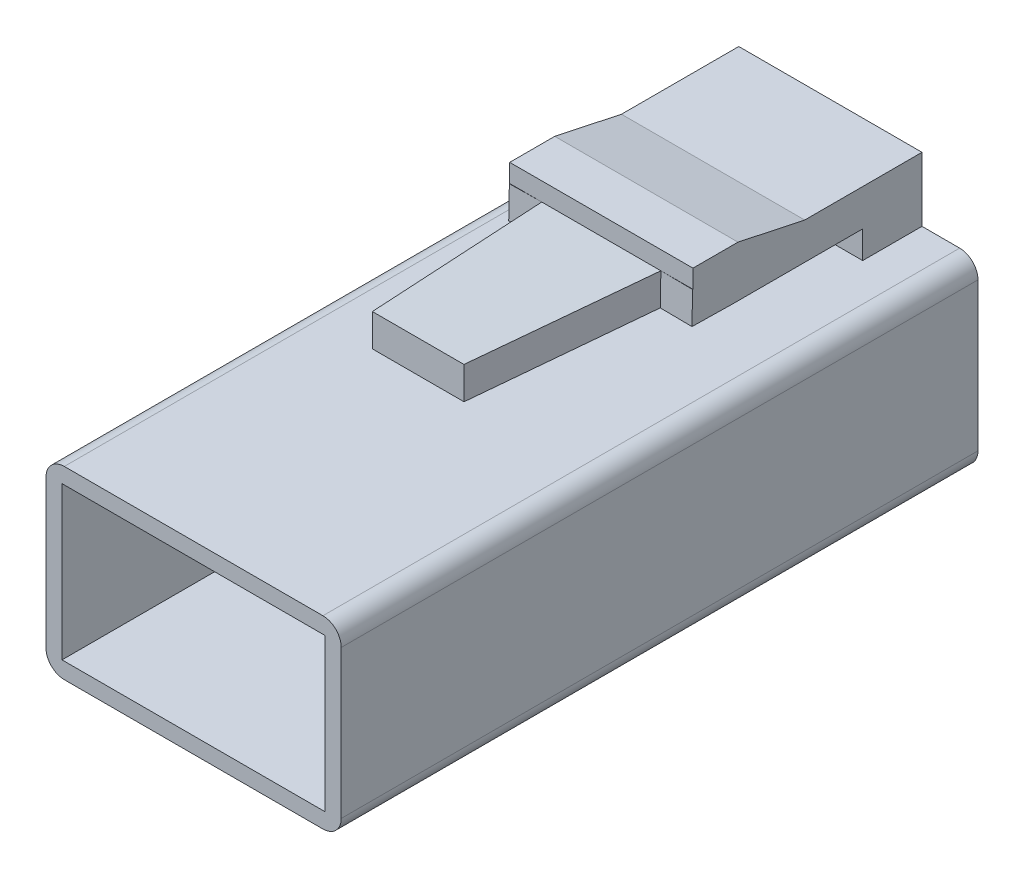
ISO-10303-21;
HEADER;
FILE_DESCRIPTION(('STEP AP214'),'2;1');
FILE_NAME('part.step','',(''),(''),'','','');
FILE_SCHEMA(('AUTOMOTIVE_DESIGN { 1 0 10303 214 1 1 1 1 }'));
ENDSEC;
DATA;
#1=APPLICATION_CONTEXT('core data for automotive mechanical design processes');
#2=APPLICATION_PROTOCOL_DEFINITION('international standard','automotive_design',2000,#1);
#3=PRODUCT_CONTEXT('',#1,'mechanical');
#4=PRODUCT('Part','Part','',(#3));
#5=PRODUCT_RELATED_PRODUCT_CATEGORY('part','',(#4));
#6=PRODUCT_DEFINITION_FORMATION('','',#4);
#7=PRODUCT_DEFINITION_CONTEXT('part definition',#1,'design');
#8=PRODUCT_DEFINITION('design','',#6,#7);
#9=PRODUCT_DEFINITION_SHAPE('','',#8);
#10=(LENGTH_UNIT() NAMED_UNIT(*) SI_UNIT(.MILLI.,.METRE.));
#11=(NAMED_UNIT(*) PLANE_ANGLE_UNIT() SI_UNIT($,.RADIAN.));
#12=(NAMED_UNIT(*) SI_UNIT($,.STERADIAN.) SOLID_ANGLE_UNIT());
#13=UNCERTAINTY_MEASURE_WITH_UNIT(LENGTH_MEASURE(1.E-05),#10,'distance_accuracy_value','');
#14=(GEOMETRIC_REPRESENTATION_CONTEXT(3) GLOBAL_UNCERTAINTY_ASSIGNED_CONTEXT((#13)) GLOBAL_UNIT_ASSIGNED_CONTEXT((#10,
#11,#12)) REPRESENTATION_CONTEXT('',''));
#15=CARTESIAN_POINT('',(0.,0.,0.));
#16=DIRECTION('',(0.,0.,1.));
#17=DIRECTION('',(1.,0.,0.));
#18=AXIS2_PLACEMENT_3D('',#15,#16,#17);
#19=CARTESIAN_POINT('',(-2.,3.326,1.1));
#20=DIRECTION('',(0.,0.999805434858456,-0.0197254259141513));
#21=DIRECTION('',(0.,0.0197254259141513,0.999805434858456));
#22=AXIS2_PLACEMENT_3D('',#19,#20,#21);
#23=PLANE('',#22);
#24=DIRECTION('',(-0.0748042062033559,-0.019670160013498,-0.997004220422025));
#25=VECTOR('',#24,1.);
#26=CARTESIAN_POINT('',(-1.,3.40488658009427,5.09845518463892));
#27=LINE('',#26,#25);
#28=CARTESIAN_POINT('',(-1.,3.40488658009427,5.09845518463892));
#29=VERTEX_POINT('',#28);
#30=CARTESIAN_POINT('',(-1.3,3.326,1.1));
#31=VERTEX_POINT('',#30);
#32=EDGE_CURVE('E250',#29,#31,#27,.T.);
#33=ORIENTED_EDGE('',*,*,#32,.F.);
#34=DIRECTION('',(1.,0.,0.));
#35=VECTOR('',#34,1.);
#36=CARTESIAN_POINT('',(-2.,3.40488658009427,5.09845518463892));
#37=LINE('',#36,#35);
#38=CARTESIAN_POINT('',(1.,3.40488658009427,5.09845518463892));
#39=VERTEX_POINT('',#38);
#40=EDGE_CURVE('E280',#29,#39,#37,.T.);
#41=ORIENTED_EDGE('',*,*,#40,.T.);
#42=DIRECTION('',(-0.0748042062033556,0.019670160013498,0.997004220422025));
#43=VECTOR('',#42,1.);
#44=CARTESIAN_POINT('',(1.,3.40488658009427,5.09845518463892));
#45=LINE('',#44,#43);
#46=CARTESIAN_POINT('',(1.3,3.326,1.1));
#47=VERTEX_POINT('',#46);
#48=EDGE_CURVE('E271',#47,#39,#45,.T.);
#49=ORIENTED_EDGE('',*,*,#48,.F.);
#50=DIRECTION('',(1.,0.,0.));
#51=VECTOR('',#50,1.);
#52=CARTESIAN_POINT('',(-2.,3.326,1.1));
#53=LINE('',#52,#51);
#54=EDGE_CURVE('E270',#31,#47,#53,.T.);
#55=ORIENTED_EDGE('',*,*,#54,.F.);
#56=EDGE_LOOP('',(#33,#41,#49,#55));
#57=FACE_BOUND('',#56,.T.);
#58=ADVANCED_FACE('F33',(#57),#23,.T.);
#59=DIRECTION('',(-0.999936480758269,-0.000222324407221732,-0.011268763047742));
#60=VECTOR('',#59,1.);
#61=CARTESIAN_POINT('',(1.3,3.326,1.1));
#62=LINE('',#61,#60);
#63=CARTESIAN_POINT('',(2.,3.326155636971,1.10788863521355));
#64=VERTEX_POINT('',#63);
#65=EDGE_CURVE('E900',#64,#47,#62,.T.);
#66=ORIENTED_EDGE('',*,*,#65,.F.);
#67=DIRECTION('',(0.,0.0197254259141513,0.999805434858455));
#68=VECTOR('',#67,1.);
#69=CARTESIAN_POINT('',(2.,3.326,1.1));
#70=LINE('',#69,#68);
#71=CARTESIAN_POINT('',(2.,3.326,1.1));
#72=VERTEX_POINT('',#71);
#73=EDGE_CURVE('E847',#72,#64,#70,.T.);
#74=ORIENTED_EDGE('',*,*,#73,.F.);
#75=EDGE_CURVE('E274',#47,#72,#53,.T.);
#76=ORIENTED_EDGE('',*,*,#75,.F.);
#77=EDGE_LOOP('',(#66,#74,#76));
#78=FACE_BOUND('',#77,.T.);
#79=ADVANCED_FACE('F472',(#78),#23,.T.);
#80=CARTESIAN_POINT('',(3.2225,2.016,10.));
#81=DIRECTION('',(0.,-1.,0.));
#82=DIRECTION('',(0.,0.,-1.));
#83=AXIS2_PLACEMENT_3D('',#80,#81,#82);
#84=PLANE('',#83);
#85=DIRECTION('',(0.,0.,-1.));
#86=VECTOR('',#85,1.);
#87=CARTESIAN_POINT('',(-2.,2.016,-2.60530460098422));
#88=LINE('',#87,#86);
#89=CARTESIAN_POINT('',(-2.,2.016,-2.60530460098422));
#90=VERTEX_POINT('',#89);
#91=CARTESIAN_POINT('',(-2.,2.016,-3.9));
#92=VERTEX_POINT('',#91);
#93=EDGE_CURVE('E862',#90,#92,#88,.T.);
#94=ORIENTED_EDGE('',*,*,#93,.T.);
#95=DIRECTION('',(-1.,0.,0.));
#96=VECTOR('',#95,1.);
#97=CARTESIAN_POINT('',(3.2225,2.016,-3.9));
#98=LINE('',#97,#96);
#99=CARTESIAN_POINT('',(-2.8225,2.016,-3.9));
#100=VERTEX_POINT('',#99);
#101=EDGE_CURVE('E361',#92,#100,#98,.T.);
#102=ORIENTED_EDGE('',*,*,#101,.T.);
#103=DIRECTION('',(0.,0.,-1.));
#104=VECTOR('',#103,1.);
#105=CARTESIAN_POINT('',(-2.8225,2.016,10.));
#106=LINE('',#105,#104);
#107=CARTESIAN_POINT('',(-2.8225,2.016,10.));
#108=VERTEX_POINT('',#107);
#109=EDGE_CURVE('E415',#100,#108,#106,.F.);
#110=ORIENTED_EDGE('',*,*,#109,.T.);
#111=DIRECTION('',(-1.,0.,0.));
#112=VECTOR('',#111,1.);
#113=CARTESIAN_POINT('',(3.2225,2.016,10.));
#114=LINE('',#113,#112);
#115=CARTESIAN_POINT('',(2.8225,2.016,10.));
#116=VERTEX_POINT('',#115);
#117=EDGE_CURVE('E383',#116,#108,#114,.T.);
#118=ORIENTED_EDGE('',*,*,#117,.F.);
#119=DIRECTION('',(0.,0.,-1.));
#120=VECTOR('',#119,1.);
#121=CARTESIAN_POINT('',(2.8225,2.016,10.));
#122=LINE('',#121,#120);
#123=CARTESIAN_POINT('',(2.8225,2.016,-3.9));
#124=VERTEX_POINT('',#123);
#125=EDGE_CURVE('E417',#116,#124,#122,.T.);
#126=ORIENTED_EDGE('',*,*,#125,.T.);
#127=CARTESIAN_POINT('',(2.,2.016,-3.9));
#128=VERTEX_POINT('',#127);
#129=EDGE_CURVE('E362',#124,#128,#98,.T.);
#130=ORIENTED_EDGE('',*,*,#129,.T.);
#131=DIRECTION('',(0.,0.,-1.));
#132=VECTOR('',#131,1.);
#133=CARTESIAN_POINT('',(2.,2.016,-2.60530460098422));
#134=LINE('',#133,#132);
#135=CARTESIAN_POINT('',(2.,2.016,-2.60530460098422));
#136=VERTEX_POINT('',#135);
#137=EDGE_CURVE('E909',#136,#128,#134,.T.);
#138=ORIENTED_EDGE('',*,*,#137,.F.);
#139=DIRECTION('',(1.,0.,0.));
#140=VECTOR('',#139,1.);
#141=CARTESIAN_POINT('',(-2.,2.016,-2.60530460098422));
#142=LINE('',#141,#140);
#143=EDGE_CURVE('E334',#90,#136,#142,.T.);
#144=ORIENTED_EDGE('',*,*,#143,.F.);
#145=EDGE_LOOP('',(#94,#102,#110,#118,#126,#130,#138,#144));
#146=FACE_BOUND('',#145,.T.);
#147=ADVANCED_FACE('F460',(#146),#84,.F.);
#148=CARTESIAN_POINT('',(0.,0.,10.));
#149=DIRECTION('',(0.,0.,1.));
#150=DIRECTION('',(1.,0.,0.));
#151=AXIS2_PLACEMENT_3D('',#148,#149,#150);
#152=PLANE('',#151);
#153=DIRECTION('',(1.,0.,0.));
#154=VECTOR('',#153,1.);
#155=CARTESIAN_POINT('',(3.2225,-2.016,10.));
#156=LINE('',#155,#154);
#157=CARTESIAN_POINT('',(-2.8225,-2.016,10.));
#158=VERTEX_POINT('',#157);
#159=CARTESIAN_POINT('',(2.8225,-2.016,10.));
#160=VERTEX_POINT('',#159);
#161=EDGE_CURVE('E377',#158,#160,#156,.T.);
#162=ORIENTED_EDGE('',*,*,#161,.T.);
#163=CARTESIAN_POINT('',(2.8225,-1.616,10.));
#164=DIRECTION('',(0.,0.,1.));
#165=DIRECTION('',(1.,0.,0.));
#166=AXIS2_PLACEMENT_3D('',#163,#164,#165);
#167=CIRCLE('',#166,0.4);
#168=CARTESIAN_POINT('',(3.2225,-1.616,10.));
#169=VERTEX_POINT('',#168);
#170=EDGE_CURVE('E413',#160,#169,#167,.T.);
#171=ORIENTED_EDGE('',*,*,#170,.T.);
#172=DIRECTION('',(0.,1.,0.));
#173=VECTOR('',#172,1.);
#174=CARTESIAN_POINT('',(3.2225,-2.016,10.));
#175=LINE('',#174,#173);
#176=CARTESIAN_POINT('',(3.2225,1.616,10.));
#177=VERTEX_POINT('',#176);
#178=EDGE_CURVE('E380',#169,#177,#175,.T.);
#179=ORIENTED_EDGE('',*,*,#178,.T.);
#180=CARTESIAN_POINT('',(2.8225,1.616,10.));
#181=DIRECTION('',(0.,0.,1.));
#182=DIRECTION('',(1.,0.,0.));
#183=AXIS2_PLACEMENT_3D('',#180,#181,#182);
#184=CIRCLE('',#183,0.4);
#185=EDGE_CURVE('E411',#177,#116,#184,.T.);
#186=ORIENTED_EDGE('',*,*,#185,.T.);
#187=ORIENTED_EDGE('',*,*,#117,.T.);
#188=CARTESIAN_POINT('',(-2.8225,1.616,10.));
#189=DIRECTION('',(0.,0.,1.));
#190=DIRECTION('',(1.,0.,0.));
#191=AXIS2_PLACEMENT_3D('',#188,#189,#190);
#192=CIRCLE('',#191,0.4);
#193=CARTESIAN_POINT('',(-3.2225,1.616,10.));
#194=VERTEX_POINT('',#193);
#195=EDGE_CURVE('E407',#108,#194,#192,.T.);
#196=ORIENTED_EDGE('',*,*,#195,.T.);
#197=DIRECTION('',(0.,-1.,0.));
#198=VECTOR('',#197,1.);
#199=CARTESIAN_POINT('',(-3.2225,-2.016,10.));
#200=LINE('',#199,#198);
#201=CARTESIAN_POINT('',(-3.2225,-1.616,10.));
#202=VERTEX_POINT('',#201);
#203=EDGE_CURVE('E374',#194,#202,#200,.T.);
#204=ORIENTED_EDGE('',*,*,#203,.T.);
#205=CARTESIAN_POINT('',(-2.8225,-1.616,10.));
#206=DIRECTION('',(0.,0.,1.));
#207=DIRECTION('',(1.,0.,0.));
#208=AXIS2_PLACEMENT_3D('',#205,#206,#207);
#209=CIRCLE('',#208,0.4);
#210=EDGE_CURVE('E409',#202,#158,#209,.T.);
#211=ORIENTED_EDGE('',*,*,#210,.T.);
#212=EDGE_LOOP('',(#162,#171,#179,#186,#187,#196,#204,#211));
#213=FACE_BOUND('',#212,.T.);
#214=DIRECTION('',(0.,-1.,0.));
#215=VECTOR('',#214,1.);
#216=CARTESIAN_POINT('',(-2.8725,-1.666,10.));
#217=LINE('',#216,#215);
#218=CARTESIAN_POINT('',(-2.8725,1.666,10.));
#219=VERTEX_POINT('',#218);
#220=CARTESIAN_POINT('',(-2.8725,-1.666,10.));
#221=VERTEX_POINT('',#220);
#222=EDGE_CURVE('E322',#219,#221,#217,.T.);
#223=ORIENTED_EDGE('',*,*,#222,.F.);
#224=DIRECTION('',(-1.,0.,0.));
#225=VECTOR('',#224,1.);
#226=CARTESIAN_POINT('',(-2.8725,1.666,10.));
#227=LINE('',#226,#225);
#228=CARTESIAN_POINT('',(2.8725,1.666,10.));
#229=VERTEX_POINT('',#228);
#230=EDGE_CURVE('E325',#229,#219,#227,.T.);
#231=ORIENTED_EDGE('',*,*,#230,.F.);
#232=DIRECTION('',(0.,1.,0.));
#233=VECTOR('',#232,1.);
#234=CARTESIAN_POINT('',(2.8725,1.666,10.));
#235=LINE('',#234,#233);
#236=CARTESIAN_POINT('',(2.8725,-1.666,10.));
#237=VERTEX_POINT('',#236);
#238=EDGE_CURVE('E305',#237,#229,#235,.T.);
#239=ORIENTED_EDGE('',*,*,#238,.F.);
#240=DIRECTION('',(1.,0.,0.));
#241=VECTOR('',#240,1.);
#242=CARTESIAN_POINT('',(2.8725,-1.666,10.));
#243=LINE('',#242,#241);
#244=EDGE_CURVE('E319',#221,#237,#243,.T.);
#245=ORIENTED_EDGE('',*,*,#244,.F.);
#246=EDGE_LOOP('',(#223,#231,#239,#245));
#247=FACE_BOUND('',#246,.T.);
#248=ADVANCED_FACE('F443',(#213,#247),#152,.T.);
#249=CARTESIAN_POINT('',(-3.2225,-2.016,10.));
#250=DIRECTION('',(1.,0.,0.));
#251=DIRECTION('',(0.,0.,-1.));
#252=AXIS2_PLACEMENT_3D('',#249,#250,#251);
#253=PLANE('',#252);
#254=DIRECTION('',(0.,-1.,0.));
#255=VECTOR('',#254,1.);
#256=CARTESIAN_POINT('',(-3.2225,-2.016,-3.9));
#257=LINE('',#256,#255);
#258=CARTESIAN_POINT('',(-3.2225,1.616,-3.9));
#259=VERTEX_POINT('',#258);
#260=CARTESIAN_POINT('',(-3.2225,-1.616,-3.9));
#261=VERTEX_POINT('',#260);
#262=EDGE_CURVE('E352',#259,#261,#257,.T.);
#263=ORIENTED_EDGE('',*,*,#262,.T.);
#264=DIRECTION('',(0.,0.,-1.));
#265=VECTOR('',#264,1.);
#266=CARTESIAN_POINT('',(-3.2225,-1.616,10.));
#267=LINE('',#266,#265);
#268=EDGE_CURVE('E11',#261,#202,#267,.F.);
#269=ORIENTED_EDGE('',*,*,#268,.T.);
#270=ORIENTED_EDGE('',*,*,#203,.F.);
#271=DIRECTION('',(0.,0.,-1.));
#272=VECTOR('',#271,1.);
#273=CARTESIAN_POINT('',(-3.2225,1.616,10.));
#274=LINE('',#273,#272);
#275=EDGE_CURVE('E41',#194,#259,#274,.T.);
#276=ORIENTED_EDGE('',*,*,#275,.T.);
#277=EDGE_LOOP('',(#263,#269,#270,#276));
#278=FACE_BOUND('',#277,.T.);
#279=ADVANCED_FACE('F424',(#278),#253,.F.);
#280=CARTESIAN_POINT('',(3.2225,-2.016,10.));
#281=DIRECTION('',(0.,1.,0.));
#282=DIRECTION('',(0.,0.,1.));
#283=AXIS2_PLACEMENT_3D('',#280,#281,#282);
#284=PLANE('',#283);
#285=DIRECTION('',(1.,0.,0.));
#286=VECTOR('',#285,1.);
#287=CARTESIAN_POINT('',(3.2225,-2.016,-3.9));
#288=LINE('',#287,#286);
#289=CARTESIAN_POINT('',(-2.8225,-2.016,-3.9));
#290=VERTEX_POINT('',#289);
#291=CARTESIAN_POINT('',(2.8225,-2.016,-3.9));
#292=VERTEX_POINT('',#291);
#293=EDGE_CURVE('E355',#290,#292,#288,.T.);
#294=ORIENTED_EDGE('',*,*,#293,.T.);
#295=DIRECTION('',(0.,0.,-1.));
#296=VECTOR('',#295,1.);
#297=CARTESIAN_POINT('',(2.8225,-2.016,10.));
#298=LINE('',#297,#296);
#299=EDGE_CURVE('E405',#292,#160,#298,.F.);
#300=ORIENTED_EDGE('',*,*,#299,.T.);
#301=ORIENTED_EDGE('',*,*,#161,.F.);
#302=DIRECTION('',(0.,0.,-1.));
#303=VECTOR('',#302,1.);
#304=CARTESIAN_POINT('',(-2.8225,-2.016,10.));
#305=LINE('',#304,#303);
#306=EDGE_CURVE('E402',#158,#290,#305,.T.);
#307=ORIENTED_EDGE('',*,*,#306,.T.);
#308=EDGE_LOOP('',(#294,#300,#301,#307));
#309=FACE_BOUND('',#308,.T.);
#310=ADVANCED_FACE('F439',(#309),#284,.F.);
#311=CARTESIAN_POINT('',(3.2225,-2.016,10.));
#312=DIRECTION('',(-1.,0.,0.));
#313=DIRECTION('',(0.,0.,1.));
#314=AXIS2_PLACEMENT_3D('',#311,#312,#313);
#315=PLANE('',#314);
#316=ORIENTED_EDGE('',*,*,#178,.F.);
#317=DIRECTION('',(0.,0.,-1.));
#318=VECTOR('',#317,1.);
#319=CARTESIAN_POINT('',(3.2225,-1.616,10.));
#320=LINE('',#319,#318);
#321=CARTESIAN_POINT('',(3.2225,-1.616,-3.9));
#322=VERTEX_POINT('',#321);
#323=EDGE_CURVE('E390',#169,#322,#320,.T.);
#324=ORIENTED_EDGE('',*,*,#323,.T.);
#325=DIRECTION('',(0.,1.,0.));
#326=VECTOR('',#325,1.);
#327=CARTESIAN_POINT('',(3.2225,-2.016,-3.9));
#328=LINE('',#327,#326);
#329=CARTESIAN_POINT('',(3.2225,1.616,-3.9));
#330=VERTEX_POINT('',#329);
#331=EDGE_CURVE('E358',#322,#330,#328,.T.);
#332=ORIENTED_EDGE('',*,*,#331,.T.);
#333=DIRECTION('',(0.,0.,-1.));
#334=VECTOR('',#333,1.);
#335=CARTESIAN_POINT('',(3.2225,1.616,10.));
#336=LINE('',#335,#334);
#337=EDGE_CURVE('E388',#330,#177,#336,.F.);
#338=ORIENTED_EDGE('',*,*,#337,.T.);
#339=EDGE_LOOP('',(#316,#324,#332,#338));
#340=FACE_BOUND('',#339,.T.);
#341=ADVANCED_FACE('F450',(#340),#315,.F.);
#342=CARTESIAN_POINT('',(-2.2725,-1.066,10.));
#343=DIRECTION('',(1.,0.,0.));
#344=DIRECTION('',(0.,0.,-1.));
#345=AXIS2_PLACEMENT_3D('',#342,#343,#344);
#346=PLANE('',#345);
#347=DIRECTION('',(0.,1.,0.));
#348=VECTOR('',#347,1.);
#349=CARTESIAN_POINT('',(-2.2725,-1.066,0.));
#350=LINE('',#349,#348);
#351=CARTESIAN_POINT('',(-2.2725,-1.066,0.));
#352=VERTEX_POINT('',#351);
#353=CARTESIAN_POINT('',(-2.2725,1.066,0.));
#354=VERTEX_POINT('',#353);
#355=EDGE_CURVE('E338',#352,#354,#350,.T.);
#356=ORIENTED_EDGE('',*,*,#355,.F.);
#357=DIRECTION('',(0.,0.,-1.));
#358=VECTOR('',#357,1.);
#359=CARTESIAN_POINT('',(-2.2725,-1.066,10.));
#360=LINE('',#359,#358);
#361=CARTESIAN_POINT('',(-2.2725,-1.066,-3.9));
#362=VERTEX_POINT('',#361);
#363=EDGE_CURVE('E372',#352,#362,#360,.T.);
#364=ORIENTED_EDGE('',*,*,#363,.T.);
#365=DIRECTION('',(0.,-1.,0.));
#366=VECTOR('',#365,1.);
#367=CARTESIAN_POINT('',(-2.2725,-1.066,-3.9));
#368=LINE('',#367,#366);
#369=CARTESIAN_POINT('',(-2.2725,1.066,-3.9));
#370=VERTEX_POINT('',#369);
#371=EDGE_CURVE('E340',#370,#362,#368,.T.);
#372=ORIENTED_EDGE('',*,*,#371,.F.);
#373=DIRECTION('',(0.,0.,-1.));
#374=VECTOR('',#373,1.);
#375=CARTESIAN_POINT('',(-2.2725,1.066,10.));
#376=LINE('',#375,#374);
#377=EDGE_CURVE('E365',#354,#370,#376,.T.);
#378=ORIENTED_EDGE('',*,*,#377,.F.);
#379=EDGE_LOOP('',(#356,#364,#372,#378));
#380=FACE_BOUND('',#379,.T.);
#381=ADVANCED_FACE('F644',(#380),#346,.T.);
#382=CARTESIAN_POINT('',(2.2725,-1.066,10.));
#383=DIRECTION('',(0.,1.,0.));
#384=DIRECTION('',(-1.,0.,0.));
#385=AXIS2_PLACEMENT_3D('',#382,#383,#384);
#386=PLANE('',#385);
#387=DIRECTION('',(-1.,0.,0.));
#388=VECTOR('',#387,1.);
#389=CARTESIAN_POINT('',(2.2725,-1.066,0.));
#390=LINE('',#389,#388);
#391=CARTESIAN_POINT('',(2.2725,-1.066,0.));
#392=VERTEX_POINT('',#391);
#393=EDGE_CURVE('E336',#392,#352,#390,.T.);
#394=ORIENTED_EDGE('',*,*,#393,.F.);
#395=DIRECTION('',(0.,0.,-1.));
#396=VECTOR('',#395,1.);
#397=CARTESIAN_POINT('',(2.2725,-1.066,10.));
#398=LINE('',#397,#396);
#399=CARTESIAN_POINT('',(2.2725,-1.066,-3.9));
#400=VERTEX_POINT('',#399);
#401=EDGE_CURVE('E370',#392,#400,#398,.T.);
#402=ORIENTED_EDGE('',*,*,#401,.T.);
#403=DIRECTION('',(1.,0.,0.));
#404=VECTOR('',#403,1.);
#405=CARTESIAN_POINT('',(2.2725,-1.066,-3.9));
#406=LINE('',#405,#404);
#407=EDGE_CURVE('E343',#362,#400,#406,.T.);
#408=ORIENTED_EDGE('',*,*,#407,.F.);
#409=ORIENTED_EDGE('',*,*,#363,.F.);
#410=EDGE_LOOP('',(#394,#402,#408,#409));
#411=FACE_BOUND('',#410,.T.);
#412=ADVANCED_FACE('F652',(#411),#386,.T.);
#413=CARTESIAN_POINT('',(2.2725,-1.066,10.));
#414=DIRECTION('',(-1.,0.,0.));
#415=DIRECTION('',(0.,0.,1.));
#416=AXIS2_PLACEMENT_3D('',#413,#414,#415);
#417=PLANE('',#416);
#418=DIRECTION('',(0.,-1.,0.));
#419=VECTOR('',#418,1.);
#420=CARTESIAN_POINT('',(2.2725,-1.066,0.));
#421=LINE('',#420,#419);
#422=CARTESIAN_POINT('',(2.2725,1.066,0.));
#423=VERTEX_POINT('',#422);
#424=EDGE_CURVE('E321',#423,#392,#421,.T.);
#425=ORIENTED_EDGE('',*,*,#424,.F.);
#426=DIRECTION('',(0.,0.,-1.));
#427=VECTOR('',#426,1.);
#428=CARTESIAN_POINT('',(2.2725,1.066,10.));
#429=LINE('',#428,#427);
#430=CARTESIAN_POINT('',(2.2725,1.066,-3.9));
#431=VERTEX_POINT('',#430);
#432=EDGE_CURVE('E368',#423,#431,#429,.T.);
#433=ORIENTED_EDGE('',*,*,#432,.T.);
#434=DIRECTION('',(0.,1.,0.));
#435=VECTOR('',#434,1.);
#436=CARTESIAN_POINT('',(2.2725,-1.066,-3.9));
#437=LINE('',#436,#435);
#438=EDGE_CURVE('E346',#400,#431,#437,.T.);
#439=ORIENTED_EDGE('',*,*,#438,.F.);
#440=ORIENTED_EDGE('',*,*,#401,.F.);
#441=EDGE_LOOP('',(#425,#433,#439,#440));
#442=FACE_BOUND('',#441,.T.);
#443=ADVANCED_FACE('F660',(#442),#417,.T.);
#444=CARTESIAN_POINT('',(2.2725,1.066,10.));
#445=DIRECTION('',(0.,-1.,0.));
#446=DIRECTION('',(1.,0.,0.));
#447=AXIS2_PLACEMENT_3D('',#444,#445,#446);
#448=PLANE('',#447);
#449=DIRECTION('',(1.,0.,0.));
#450=VECTOR('',#449,1.);
#451=CARTESIAN_POINT('',(2.2725,1.066,0.));
#452=LINE('',#451,#450);
#453=EDGE_CURVE('E386',#354,#423,#452,.T.);
#454=ORIENTED_EDGE('',*,*,#453,.F.);
#455=ORIENTED_EDGE('',*,*,#377,.T.);
#456=DIRECTION('',(-1.,0.,0.));
#457=VECTOR('',#456,1.);
#458=CARTESIAN_POINT('',(2.2725,1.066,-3.9));
#459=LINE('',#458,#457);
#460=EDGE_CURVE('E349',#431,#370,#459,.T.);
#461=ORIENTED_EDGE('',*,*,#460,.F.);
#462=ORIENTED_EDGE('',*,*,#432,.F.);
#463=EDGE_LOOP('',(#454,#455,#461,#462));
#464=FACE_BOUND('',#463,.T.);
#465=ADVANCED_FACE('F668',(#464),#448,.T.);
#466=CARTESIAN_POINT('',(0.,0.,-3.9));
#467=DIRECTION('',(0.,0.,1.));
#468=DIRECTION('',(1.,0.,0.));
#469=AXIS2_PLACEMENT_3D('',#466,#467,#468);
#470=PLANE('',#469);
#471=ORIENTED_EDGE('',*,*,#460,.T.);
#472=ORIENTED_EDGE('',*,*,#371,.T.);
#473=ORIENTED_EDGE('',*,*,#407,.T.);
#474=ORIENTED_EDGE('',*,*,#438,.T.);
#475=EDGE_LOOP('',(#471,#472,#473,#474));
#476=FACE_BOUND('',#475,.T.);
#477=ORIENTED_EDGE('',*,*,#331,.F.);
#478=CARTESIAN_POINT('',(2.8225,-1.616,-3.9));
#479=DIRECTION('',(0.,0.,1.));
#480=DIRECTION('',(1.,0.,0.));
#481=AXIS2_PLACEMENT_3D('',#478,#479,#480);
#482=CIRCLE('',#481,0.4);
#483=EDGE_CURVE('E400',#322,#292,#482,.F.);
#484=ORIENTED_EDGE('',*,*,#483,.T.);
#485=ORIENTED_EDGE('',*,*,#293,.F.);
#486=CARTESIAN_POINT('',(-2.8225,-1.616,-3.9));
#487=DIRECTION('',(0.,0.,1.));
#488=DIRECTION('',(1.,0.,0.));
#489=AXIS2_PLACEMENT_3D('',#486,#487,#488);
#490=CIRCLE('',#489,0.4);
#491=EDGE_CURVE('E396',#290,#261,#490,.F.);
#492=ORIENTED_EDGE('',*,*,#491,.T.);
#493=ORIENTED_EDGE('',*,*,#262,.F.);
#494=CARTESIAN_POINT('',(-2.8225,1.616,-3.9));
#495=DIRECTION('',(0.,0.,1.));
#496=DIRECTION('',(1.,0.,0.));
#497=AXIS2_PLACEMENT_3D('',#494,#495,#496);
#498=CIRCLE('',#497,0.4);
#499=EDGE_CURVE('E393',#259,#100,#498,.F.);
#500=ORIENTED_EDGE('',*,*,#499,.T.);
#501=ORIENTED_EDGE('',*,*,#101,.F.);
#502=EDGE_CURVE('E366',#128,#92,#98,.T.);
#503=ORIENTED_EDGE('',*,*,#502,.F.);
#504=ORIENTED_EDGE('',*,*,#129,.F.);
#505=CARTESIAN_POINT('',(2.8225,1.616,-3.9));
#506=DIRECTION('',(0.,0.,1.));
#507=DIRECTION('',(1.,0.,0.));
#508=AXIS2_PLACEMENT_3D('',#505,#506,#507);
#509=CIRCLE('',#508,0.4);
#510=EDGE_CURVE('E398',#124,#330,#509,.F.);
#511=ORIENTED_EDGE('',*,*,#510,.T.);
#512=EDGE_LOOP('',(#477,#484,#485,#492,#493,#500,#501,#503,#504,#511));
#513=FACE_BOUND('',#512,.T.);
#514=ADVANCED_FACE('F430',(#476,#513),#470,.F.);
#515=CARTESIAN_POINT('',(-2.8725,1.666,16.6413288579922));
#516=DIRECTION('',(0.,-1.,0.));
#517=DIRECTION('',(0.,0.,-1.));
#518=AXIS2_PLACEMENT_3D('',#515,#516,#517);
#519=PLANE('',#518);
#520=ORIENTED_EDGE('',*,*,#230,.T.);
#521=DIRECTION('',(0.,0.,-1.));
#522=VECTOR('',#521,1.);
#523=CARTESIAN_POINT('',(-2.8725,1.666,16.6413288579922));
#524=LINE('',#523,#522);
#525=CARTESIAN_POINT('',(-2.8725,1.666,0.));
#526=VERTEX_POINT('',#525);
#527=EDGE_CURVE('E314',#219,#526,#524,.T.);
#528=ORIENTED_EDGE('',*,*,#527,.T.);
#529=DIRECTION('',(-1.,0.,0.));
#530=VECTOR('',#529,1.);
#531=CARTESIAN_POINT('',(-2.8725,1.666,0.));
#532=LINE('',#531,#530);
#533=CARTESIAN_POINT('',(2.8725,1.666,0.));
#534=VERTEX_POINT('',#533);
#535=EDGE_CURVE('E315',#534,#526,#532,.T.);
#536=ORIENTED_EDGE('',*,*,#535,.F.);
#537=DIRECTION('',(0.,0.,-1.));
#538=VECTOR('',#537,1.);
#539=CARTESIAN_POINT('',(2.8725,1.666,16.6413288579922));
#540=LINE('',#539,#538);
#541=EDGE_CURVE('E318',#229,#534,#540,.T.);
#542=ORIENTED_EDGE('',*,*,#541,.F.);
#543=EDGE_LOOP('',(#520,#528,#536,#542));
#544=FACE_BOUND('',#543,.T.);
#545=ADVANCED_FACE('F683',(#544),#519,.T.);
#546=CARTESIAN_POINT('',(-2.8725,-1.666,16.6413288579922));
#547=DIRECTION('',(1.,0.,0.));
#548=DIRECTION('',(0.,0.,-1.));
#549=AXIS2_PLACEMENT_3D('',#546,#547,#548);
#550=PLANE('',#549);
#551=ORIENTED_EDGE('',*,*,#222,.T.);
#552=DIRECTION('',(0.,0.,-1.));
#553=VECTOR('',#552,1.);
#554=CARTESIAN_POINT('',(-2.8725,-1.666,16.6413288579922));
#555=LINE('',#554,#553);
#556=CARTESIAN_POINT('',(-2.8725,-1.666,0.));
#557=VERTEX_POINT('',#556);
#558=EDGE_CURVE('E310',#221,#557,#555,.T.);
#559=ORIENTED_EDGE('',*,*,#558,.T.);
#560=DIRECTION('',(0.,-1.,0.));
#561=VECTOR('',#560,1.);
#562=CARTESIAN_POINT('',(-2.8725,-1.666,0.));
#563=LINE('',#562,#561);
#564=EDGE_CURVE('E311',#526,#557,#563,.T.);
#565=ORIENTED_EDGE('',*,*,#564,.F.);
#566=ORIENTED_EDGE('',*,*,#527,.F.);
#567=EDGE_LOOP('',(#551,#559,#565,#566));
#568=FACE_BOUND('',#567,.T.);
#569=ADVANCED_FACE('F691',(#568),#550,.T.);
#570=CARTESIAN_POINT('',(2.8725,-1.666,16.6413288579922));
#571=DIRECTION('',(0.,1.,0.));
#572=DIRECTION('',(-1.,0.,0.));
#573=AXIS2_PLACEMENT_3D('',#570,#571,#572);
#574=PLANE('',#573);
#575=ORIENTED_EDGE('',*,*,#244,.T.);
#576=DIRECTION('',(0.,0.,-1.));
#577=VECTOR('',#576,1.);
#578=CARTESIAN_POINT('',(2.8725,-1.666,16.6413288579922));
#579=LINE('',#578,#577);
#580=CARTESIAN_POINT('',(2.8725,-1.666,0.));
#581=VERTEX_POINT('',#580);
#582=EDGE_CURVE('E306',#237,#581,#579,.T.);
#583=ORIENTED_EDGE('',*,*,#582,.T.);
#584=DIRECTION('',(1.,0.,0.));
#585=VECTOR('',#584,1.);
#586=CARTESIAN_POINT('',(2.8725,-1.666,0.));
#587=LINE('',#586,#585);
#588=EDGE_CURVE('E307',#557,#581,#587,.T.);
#589=ORIENTED_EDGE('',*,*,#588,.F.);
#590=ORIENTED_EDGE('',*,*,#558,.F.);
#591=EDGE_LOOP('',(#575,#583,#589,#590));
#592=FACE_BOUND('',#591,.T.);
#593=ADVANCED_FACE('F699',(#592),#574,.T.);
#594=CARTESIAN_POINT('',(2.8725,1.666,16.6413288579922));
#595=DIRECTION('',(-1.,0.,0.));
#596=DIRECTION('',(0.,0.,1.));
#597=AXIS2_PLACEMENT_3D('',#594,#595,#596);
#598=PLANE('',#597);
#599=ORIENTED_EDGE('',*,*,#238,.T.);
#600=ORIENTED_EDGE('',*,*,#541,.T.);
#601=DIRECTION('',(0.,1.,0.));
#602=VECTOR('',#601,1.);
#603=CARTESIAN_POINT('',(2.8725,1.666,0.));
#604=LINE('',#603,#602);
#605=EDGE_CURVE('E302',#581,#534,#604,.T.);
#606=ORIENTED_EDGE('',*,*,#605,.F.);
#607=ORIENTED_EDGE('',*,*,#582,.F.);
#608=EDGE_LOOP('',(#599,#600,#606,#607));
#609=FACE_BOUND('',#608,.T.);
#610=ADVANCED_FACE('F707',(#609),#598,.T.);
#611=CARTESIAN_POINT('',(0.,0.,0.));
#612=DIRECTION('',(0.,0.,-1.));
#613=DIRECTION('',(-1.,0.,0.));
#614=AXIS2_PLACEMENT_3D('',#611,#612,#613);
#615=PLANE('',#614);
#616=ORIENTED_EDGE('',*,*,#355,.T.);
#617=ORIENTED_EDGE('',*,*,#453,.T.);
#618=ORIENTED_EDGE('',*,*,#424,.T.);
#619=ORIENTED_EDGE('',*,*,#393,.T.);
#620=EDGE_LOOP('',(#616,#617,#618,#619));
#621=FACE_BOUND('',#620,.T.);
#622=ORIENTED_EDGE('',*,*,#535,.T.);
#623=ORIENTED_EDGE('',*,*,#564,.T.);
#624=ORIENTED_EDGE('',*,*,#588,.T.);
#625=ORIENTED_EDGE('',*,*,#605,.T.);
#626=EDGE_LOOP('',(#622,#623,#624,#625));
#627=FACE_BOUND('',#626,.T.);
#628=ADVANCED_FACE('F715',(#621,#627),#615,.F.);
#629=CARTESIAN_POINT('',(2.8225,-1.616,10.));
#630=DIRECTION('',(0.,0.,-1.));
#631=DIRECTION('',(-1.,0.,0.));
#632=AXIS2_PLACEMENT_3D('',#629,#630,#631);
#633=CYLINDRICAL_SURFACE('',#632,0.4);
#634=ORIENTED_EDGE('',*,*,#170,.F.);
#635=ORIENTED_EDGE('',*,*,#299,.F.);
#636=ORIENTED_EDGE('',*,*,#483,.F.);
#637=ORIENTED_EDGE('',*,*,#323,.F.);
#638=EDGE_LOOP('',(#634,#635,#636,#637));
#639=FACE_BOUND('',#638,.T.);
#640=ADVANCED_FACE('F448',(#639),#633,.T.);
#641=CARTESIAN_POINT('',(2.8225,1.616,10.));
#642=DIRECTION('',(0.,0.,-1.));
#643=DIRECTION('',(-1.,0.,0.));
#644=AXIS2_PLACEMENT_3D('',#641,#642,#643);
#645=CYLINDRICAL_SURFACE('',#644,0.4);
#646=ORIENTED_EDGE('',*,*,#185,.F.);
#647=ORIENTED_EDGE('',*,*,#337,.F.);
#648=ORIENTED_EDGE('',*,*,#510,.F.);
#649=ORIENTED_EDGE('',*,*,#125,.F.);
#650=EDGE_LOOP('',(#646,#647,#648,#649));
#651=FACE_BOUND('',#650,.T.);
#652=ADVANCED_FACE('F456',(#651),#645,.T.);
#653=CARTESIAN_POINT('',(-2.8225,-1.616,10.));
#654=DIRECTION('',(0.,0.,-1.));
#655=DIRECTION('',(-1.,0.,0.));
#656=AXIS2_PLACEMENT_3D('',#653,#654,#655);
#657=CYLINDRICAL_SURFACE('',#656,0.4);
#658=ORIENTED_EDGE('',*,*,#210,.F.);
#659=ORIENTED_EDGE('',*,*,#268,.F.);
#660=ORIENTED_EDGE('',*,*,#491,.F.);
#661=ORIENTED_EDGE('',*,*,#306,.F.);
#662=EDGE_LOOP('',(#658,#659,#660,#661));
#663=FACE_BOUND('',#662,.T.);
#664=ADVANCED_FACE('F436',(#663),#657,.T.);
#665=CARTESIAN_POINT('',(-2.8225,1.616,10.));
#666=DIRECTION('',(0.,0.,-1.));
#667=DIRECTION('',(-1.,0.,0.));
#668=AXIS2_PLACEMENT_3D('',#665,#666,#667);
#669=CYLINDRICAL_SURFACE('',#668,0.4);
#670=ORIENTED_EDGE('',*,*,#195,.F.);
#671=ORIENTED_EDGE('',*,*,#109,.F.);
#672=ORIENTED_EDGE('',*,*,#499,.F.);
#673=ORIENTED_EDGE('',*,*,#275,.F.);
#674=EDGE_LOOP('',(#670,#671,#672,#673));
#675=FACE_BOUND('',#674,.T.);
#676=ADVANCED_FACE('F35',(#675),#669,.T.);
#677=CARTESIAN_POINT('',(-2.,2.016,-3.9));
#678=DIRECTION('',(0.,-1.,0.));
#679=DIRECTION('',(0.,0.,-1.));
#680=AXIS2_PLACEMENT_3D('',#677,#678,#679);
#681=PLANE('',#680);
#682=ORIENTED_EDGE('',*,*,#502,.T.);
#683=CARTESIAN_POINT('',(-2.,2.016,-3.9001));
#684=VERTEX_POINT('',#683);
#685=EDGE_CURVE('E861',#92,#684,#88,.T.);
#686=ORIENTED_EDGE('',*,*,#685,.T.);
#687=DIRECTION('',(1.,0.,0.));
#688=VECTOR('',#687,1.);
#689=CARTESIAN_POINT('',(-2.,2.016,-3.9001));
#690=LINE('',#689,#688);
#691=CARTESIAN_POINT('',(2.,2.016,-3.9001));
#692=VERTEX_POINT('',#691);
#693=EDGE_CURVE('E298',#684,#692,#690,.T.);
#694=ORIENTED_EDGE('',*,*,#693,.T.);
#695=EDGE_CURVE('E908',#128,#692,#134,.T.);
#696=ORIENTED_EDGE('',*,*,#695,.F.);
#697=EDGE_LOOP('',(#682,#686,#694,#696));
#698=FACE_BOUND('',#697,.T.);
#699=ADVANCED_FACE('F463',(#698),#681,.T.);
#700=CARTESIAN_POINT('',(-2.,2.616,-2.60530460098422));
#701=DIRECTION('',(0.,0.,1.));
#702=DIRECTION('',(1.,0.,0.));
#703=AXIS2_PLACEMENT_3D('',#700,#701,#702);
#704=PLANE('',#703);
#705=ORIENTED_EDGE('',*,*,#143,.T.);
#706=DIRECTION('',(0.,-1.,0.));
#707=VECTOR('',#706,1.);
#708=CARTESIAN_POINT('',(2.,2.616,-2.60530460098422));
#709=LINE('',#708,#707);
#710=CARTESIAN_POINT('',(2.,2.616,-2.60530460098422));
#711=VERTEX_POINT('',#710);
#712=EDGE_CURVE('E858',#711,#136,#709,.T.);
#713=ORIENTED_EDGE('',*,*,#712,.F.);
#714=DIRECTION('',(1.,0.,0.));
#715=VECTOR('',#714,1.);
#716=CARTESIAN_POINT('',(-2.,2.616,-2.60530460098422));
#717=LINE('',#716,#715);
#718=CARTESIAN_POINT('',(-2.,2.616,-2.60530460098422));
#719=VERTEX_POINT('',#718);
#720=EDGE_CURVE('E884',#719,#711,#717,.T.);
#721=ORIENTED_EDGE('',*,*,#720,.F.);
#722=DIRECTION('',(0.,-1.,0.));
#723=VECTOR('',#722,1.);
#724=CARTESIAN_POINT('',(-2.,2.616,-2.60530460098422));
#725=LINE('',#724,#723);
#726=EDGE_CURVE('E301',#719,#90,#725,.T.);
#727=ORIENTED_EDGE('',*,*,#726,.T.);
#728=EDGE_LOOP('',(#705,#713,#721,#727));
#729=FACE_BOUND('',#728,.T.);
#730=ADVANCED_FACE('F468',(#729),#704,.T.);
#731=CARTESIAN_POINT('',(-2.,2.616,0.216775102824342));
#732=DIRECTION('',(0.,-1.,0.));
#733=DIRECTION('',(0.,0.,-1.));
#734=AXIS2_PLACEMENT_3D('',#731,#732,#733);
#735=PLANE('',#734);
#736=ORIENTED_EDGE('',*,*,#720,.T.);
#737=DIRECTION('',(0.,0.,-1.));
#738=VECTOR('',#737,1.);
#739=CARTESIAN_POINT('',(2.,2.616,0.216775102824342));
#740=LINE('',#739,#738);
#741=CARTESIAN_POINT('',(2.,2.616,0.216775102824342));
#742=VERTEX_POINT('',#741);
#743=EDGE_CURVE('E855',#742,#711,#740,.T.);
#744=ORIENTED_EDGE('',*,*,#743,.F.);
#745=DIRECTION('',(1.,0.,0.));
#746=VECTOR('',#745,1.);
#747=CARTESIAN_POINT('',(-2.,2.616,0.216775102824342));
#748=LINE('',#747,#746);
#749=CARTESIAN_POINT('',(-2.,2.616,0.216775102824342));
#750=VERTEX_POINT('',#749);
#751=EDGE_CURVE('E886',#750,#742,#748,.T.);
#752=ORIENTED_EDGE('',*,*,#751,.F.);
#753=DIRECTION('',(0.,0.,-1.));
#754=VECTOR('',#753,1.);
#755=CARTESIAN_POINT('',(-2.,2.616,0.216775102824342));
#756=LINE('',#755,#754);
#757=EDGE_CURVE('E877',#750,#719,#756,.T.);
#758=ORIENTED_EDGE('',*,*,#757,.T.);
#759=EDGE_LOOP('',(#736,#744,#752,#758));
#760=FACE_BOUND('',#759,.T.);
#761=ADVANCED_FACE('F492',(#760),#735,.T.);
#762=CARTESIAN_POINT('',(-2.,2.69906963534574,5.09845518463892));
#763=DIRECTION('',(0.,-0.999855248964891,0.0170141446260373));
#764=DIRECTION('',(0.,-0.0170141446260373,-0.999855248964891));
#765=AXIS2_PLACEMENT_3D('',#762,#763,#764);
#766=PLANE('',#765);
#767=DIRECTION('',(-0.0748039327049657,-0.0169664754327229,-0.997053915474615));
#768=VECTOR('',#767,1.);
#769=CARTESIAN_POINT('',(-0.99916722308154,2.69949540063216,5.12347575815623));
#770=LINE('',#769,#768);
#771=CARTESIAN_POINT('',(-1.00104439067356,2.69906963534574,5.09845518463892));
#772=VERTEX_POINT('',#771);
#773=CARTESIAN_POINT('',(-1.3,2.63126273245045,1.11370665533819));
#774=VERTEX_POINT('',#773);
#775=EDGE_CURVE('E247',#772,#774,#770,.T.);
#776=ORIENTED_EDGE('',*,*,#775,.T.);
#777=DIRECTION('',(-0.99993648029122,0.000191766380156685,0.0112693659298766));
#778=VECTOR('',#777,1.);
#779=CARTESIAN_POINT('',(-1.30012615370754,2.63126275664402,1.11370807710079));
#780=LINE('',#779,#778);
#781=CARTESIAN_POINT('',(-2.,2.63139697744376,1.12159571259972));
#782=VERTEX_POINT('',#781);
#783=EDGE_CURVE('E244',#774,#782,#780,.T.);
#784=ORIENTED_EDGE('',*,*,#783,.T.);
#785=DIRECTION('',(0.,-0.0170141446260373,-0.999855248964891));
#786=VECTOR('',#785,1.);
#787=CARTESIAN_POINT('',(-2.,2.69906963534574,5.09845518463892));
#788=LINE('',#787,#786);
#789=EDGE_CURVE('E875',#782,#750,#788,.T.);
#790=ORIENTED_EDGE('',*,*,#789,.T.);
#791=ORIENTED_EDGE('',*,*,#751,.T.);
#792=DIRECTION('',(0.,-0.0170141446260373,-0.999855248964891));
#793=VECTOR('',#792,1.);
#794=CARTESIAN_POINT('',(2.,2.69906963534574,5.09845518463892));
#795=LINE('',#794,#793);
#796=CARTESIAN_POINT('',(2.,2.63139697744376,1.12159571259972));
#797=VERTEX_POINT('',#796);
#798=EDGE_CURVE('E853',#797,#742,#795,.T.);
#799=ORIENTED_EDGE('',*,*,#798,.F.);
#800=DIRECTION('',(-0.99993648029122,-0.00019176638015668,-0.0112693659298763));
#801=VECTOR('',#800,1.);
#802=CARTESIAN_POINT('',(1.30012615370754,2.63126275664402,1.11370807710079));
#803=LINE('',#802,#801);
#804=CARTESIAN_POINT('',(1.3,2.63126273245045,1.11370665533818));
#805=VERTEX_POINT('',#804);
#806=EDGE_CURVE('E56',#797,#805,#803,.T.);
#807=ORIENTED_EDGE('',*,*,#806,.T.);
#808=DIRECTION('',(-0.0748039327049655,0.0169664754327229,0.997053915474615));
#809=VECTOR('',#808,1.);
#810=CARTESIAN_POINT('',(0.999167223081541,2.69949540063216,5.12347575815623));
#811=LINE('',#810,#809);
#812=CARTESIAN_POINT('',(1.00104439067356,2.69906963534574,5.09845518463892));
#813=VERTEX_POINT('',#812);
#814=EDGE_CURVE('E266',#805,#813,#811,.T.);
#815=ORIENTED_EDGE('',*,*,#814,.T.);
#816=DIRECTION('',(1.,0.,0.));
#817=VECTOR('',#816,1.);
#818=CARTESIAN_POINT('',(-2.,2.69906963534574,5.09845518463892));
#819=LINE('',#818,#817);
#820=EDGE_CURVE('E281',#772,#813,#819,.T.);
#821=ORIENTED_EDGE('',*,*,#820,.F.);
#822=EDGE_LOOP('',(#776,#784,#790,#791,#799,#807,#815,#821));
#823=FACE_BOUND('',#822,.T.);
#824=ADVANCED_FACE('F487',(#823),#766,.T.);
#825=CARTESIAN_POINT('',(-2.,3.40488658009427,5.09845518463892));
#826=DIRECTION('',(0.,0.,1.));
#827=DIRECTION('',(1.,0.,0.));
#828=AXIS2_PLACEMENT_3D('',#825,#826,#827);
#829=PLANE('',#828);
#830=DIRECTION('',(0.0014796889448416,0.999998905259714,0.));
#831=VECTOR('',#830,1.);
#832=CARTESIAN_POINT('',(-1.00000218947937,3.4034068927693,5.09845518463892));
#833=LINE('',#832,#831);
#834=EDGE_CURVE('E253',#772,#29,#833,.T.);
#835=ORIENTED_EDGE('',*,*,#834,.F.);
#836=ORIENTED_EDGE('',*,*,#820,.T.);
#837=DIRECTION('',(0.0014796889448416,-0.999998905259714,0.));
#838=VECTOR('',#837,1.);
#839=CARTESIAN_POINT('',(0.999993431561881,3.40932564206917,5.09845518463892));
#840=LINE('',#839,#838);
#841=EDGE_CURVE('E892',#39,#813,#840,.T.);
#842=ORIENTED_EDGE('',*,*,#841,.F.);
#843=ORIENTED_EDGE('',*,*,#40,.F.);
#844=EDGE_LOOP('',(#835,#836,#842,#843));
#845=FACE_BOUND('',#844,.T.);
#846=ADVANCED_FACE('F481',(#845),#829,.T.);
#847=DIRECTION('',(-0.999936480758269,0.000222324407221732,0.0112687630477423));
#848=VECTOR('',#847,1.);
#849=CARTESIAN_POINT('',(-1.3,3.326,1.1));
#850=LINE('',#849,#848);
#851=CARTESIAN_POINT('',(-2.,3.326155636971,1.10788863521355));
#852=VERTEX_POINT('',#851);
#853=EDGE_CURVE('E48',#31,#852,#850,.T.);
#854=ORIENTED_EDGE('',*,*,#853,.F.);
#855=CARTESIAN_POINT('',(-2.,3.326,1.1));
#856=VERTEX_POINT('',#855);
#857=EDGE_CURVE('E263',#856,#31,#53,.T.);
#858=ORIENTED_EDGE('',*,*,#857,.F.);
#859=DIRECTION('',(0.,0.0197254259141513,0.999805434858455));
#860=VECTOR('',#859,1.);
#861=CARTESIAN_POINT('',(-2.,3.326,1.1));
#862=LINE('',#861,#860);
#863=EDGE_CURVE('E265',#856,#852,#862,.T.);
#864=ORIENTED_EDGE('',*,*,#863,.T.);
#865=EDGE_LOOP('',(#854,#858,#864));
#866=FACE_BOUND('',#865,.T.);
#867=ADVANCED_FACE('F261',(#866),#23,.T.);
#868=CARTESIAN_POINT('',(-2.,3.726,1.1));
#869=DIRECTION('',(0.,0.,1.));
#870=DIRECTION('',(1.,0.,0.));
#871=AXIS2_PLACEMENT_3D('',#868,#869,#870);
#872=PLANE('',#871);
#873=ORIENTED_EDGE('',*,*,#857,.T.);
#874=ORIENTED_EDGE('',*,*,#54,.T.);
#875=ORIENTED_EDGE('',*,*,#75,.T.);
#876=DIRECTION('',(0.,-1.,0.));
#877=VECTOR('',#876,1.);
#878=CARTESIAN_POINT('',(2.,3.726,1.1));
#879=LINE('',#878,#877);
#880=CARTESIAN_POINT('',(2.,3.726,1.1));
#881=VERTEX_POINT('',#880);
#882=EDGE_CURVE('E845',#881,#72,#879,.T.);
#883=ORIENTED_EDGE('',*,*,#882,.F.);
#884=DIRECTION('',(1.,0.,0.));
#885=VECTOR('',#884,1.);
#886=CARTESIAN_POINT('',(-2.,3.726,1.1));
#887=LINE('',#886,#885);
#888=CARTESIAN_POINT('',(-2.,3.726,1.1));
#889=VERTEX_POINT('',#888);
#890=EDGE_CURVE('E284',#889,#881,#887,.T.);
#891=ORIENTED_EDGE('',*,*,#890,.F.);
#892=DIRECTION('',(0.,-1.,0.));
#893=VECTOR('',#892,1.);
#894=CARTESIAN_POINT('',(-2.,3.726,1.1));
#895=LINE('',#894,#893);
#896=EDGE_CURVE('E279',#889,#856,#895,.T.);
#897=ORIENTED_EDGE('',*,*,#896,.T.);
#898=EDGE_LOOP('',(#873,#874,#875,#883,#891,#897));
#899=FACE_BOUND('',#898,.T.);
#900=ADVANCED_FACE('F277',(#899),#872,.T.);
#901=CARTESIAN_POINT('',(-2.,3.726,0.117243489549749));
#902=DIRECTION('',(0.,1.,0.));
#903=DIRECTION('',(0.,0.,1.));
#904=AXIS2_PLACEMENT_3D('',#901,#902,#903);
#905=PLANE('',#904);
#906=ORIENTED_EDGE('',*,*,#890,.T.);
#907=DIRECTION('',(0.,0.,1.));
#908=VECTOR('',#907,1.);
#909=CARTESIAN_POINT('',(2.,3.726,0.117243489549749));
#910=LINE('',#909,#908);
#911=CARTESIAN_POINT('',(2.,3.726,0.117243489549749));
#912=VERTEX_POINT('',#911);
#913=EDGE_CURVE('E840',#912,#881,#910,.T.);
#914=ORIENTED_EDGE('',*,*,#913,.F.);
#915=DIRECTION('',(1.,0.,0.));
#916=VECTOR('',#915,1.);
#917=CARTESIAN_POINT('',(-2.,3.726,0.117243489549749));
#918=LINE('',#917,#916);
#919=CARTESIAN_POINT('',(-2.,3.726,0.117243489549749));
#920=VERTEX_POINT('',#919);
#921=EDGE_CURVE('E287',#920,#912,#918,.T.);
#922=ORIENTED_EDGE('',*,*,#921,.F.);
#923=DIRECTION('',(0.,0.,1.));
#924=VECTOR('',#923,1.);
#925=CARTESIAN_POINT('',(-2.,3.726,0.117243489549749));
#926=LINE('',#925,#924);
#927=EDGE_CURVE('E871',#920,#889,#926,.T.);
#928=ORIENTED_EDGE('',*,*,#927,.T.);
#929=EDGE_LOOP('',(#906,#914,#922,#928));
#930=FACE_BOUND('',#929,.T.);
#931=ADVANCED_FACE('F486',(#930),#905,.T.);
#932=CARTESIAN_POINT('',(-2.,3.416,-1.33985387379636));
#933=DIRECTION('',(0.,0.97810875943982,-0.208094340881955));
#934=DIRECTION('',(0.,0.208094340881955,0.978108759439821));
#935=AXIS2_PLACEMENT_3D('',#932,#933,#934);
#936=PLANE('',#935);
#937=ORIENTED_EDGE('',*,*,#921,.T.);
#938=DIRECTION('',(0.,0.208094340881955,0.978108759439821));
#939=VECTOR('',#938,1.);
#940=CARTESIAN_POINT('',(2.,3.416,-1.33985387379636));
#941=LINE('',#940,#939);
#942=CARTESIAN_POINT('',(2.,3.416,-1.33985387379636));
#943=VERTEX_POINT('',#942);
#944=EDGE_CURVE('E835',#943,#912,#941,.T.);
#945=ORIENTED_EDGE('',*,*,#944,.F.);
#946=DIRECTION('',(1.,0.,0.));
#947=VECTOR('',#946,1.);
#948=CARTESIAN_POINT('',(-2.,3.416,-1.33985387379636));
#949=LINE('',#948,#947);
#950=CARTESIAN_POINT('',(-2.,3.416,-1.33985387379636));
#951=VERTEX_POINT('',#950);
#952=EDGE_CURVE('E292',#951,#943,#949,.T.);
#953=ORIENTED_EDGE('',*,*,#952,.F.);
#954=DIRECTION('',(0.,0.208094340881955,0.978108759439821));
#955=VECTOR('',#954,1.);
#956=CARTESIAN_POINT('',(-2.,3.416,-1.33985387379636));
#957=LINE('',#956,#955);
#958=EDGE_CURVE('E837',#951,#920,#957,.T.);
#959=ORIENTED_EDGE('',*,*,#958,.T.);
#960=EDGE_LOOP('',(#937,#945,#953,#959));
#961=FACE_BOUND('',#960,.T.);
#962=ADVANCED_FACE('F558',(#961),#936,.T.);
#963=CARTESIAN_POINT('',(-2.,3.416,-3.9001));
#964=DIRECTION('',(0.,1.,0.));
#965=DIRECTION('',(0.,0.,1.));
#966=AXIS2_PLACEMENT_3D('',#963,#964,#965);
#967=PLANE('',#966);
#968=ORIENTED_EDGE('',*,*,#952,.T.);
#969=DIRECTION('',(0.,0.,1.));
#970=VECTOR('',#969,1.);
#971=CARTESIAN_POINT('',(2.,3.416,-3.9001));
#972=LINE('',#971,#970);
#973=CARTESIAN_POINT('',(2.,3.416,-3.9001));
#974=VERTEX_POINT('',#973);
#975=EDGE_CURVE('E843',#974,#943,#972,.T.);
#976=ORIENTED_EDGE('',*,*,#975,.F.);
#977=DIRECTION('',(1.,0.,0.));
#978=VECTOR('',#977,1.);
#979=CARTESIAN_POINT('',(-2.,3.416,-3.9001));
#980=LINE('',#979,#978);
#981=CARTESIAN_POINT('',(-2.,3.416,-3.9001));
#982=VERTEX_POINT('',#981);
#983=EDGE_CURVE('E296',#982,#974,#980,.T.);
#984=ORIENTED_EDGE('',*,*,#983,.F.);
#985=DIRECTION('',(0.,0.,1.));
#986=VECTOR('',#985,1.);
#987=CARTESIAN_POINT('',(-2.,3.416,-3.9001));
#988=LINE('',#987,#986);
#989=EDGE_CURVE('E867',#982,#951,#988,.T.);
#990=ORIENTED_EDGE('',*,*,#989,.T.);
#991=EDGE_LOOP('',(#968,#976,#984,#990));
#992=FACE_BOUND('',#991,.T.);
#993=ADVANCED_FACE('F550',(#992),#967,.T.);
#994=CARTESIAN_POINT('',(-2.,2.016,-3.9001));
#995=DIRECTION('',(0.,0.,-1.));
#996=DIRECTION('',(-1.,0.,0.));
#997=AXIS2_PLACEMENT_3D('',#994,#995,#996);
#998=PLANE('',#997);
#999=ORIENTED_EDGE('',*,*,#983,.T.);
#1000=DIRECTION('',(0.,1.,0.));
#1001=VECTOR('',#1000,1.);
#1002=CARTESIAN_POINT('',(2.,2.016,-3.9001));
#1003=LINE('',#1002,#1001);
#1004=EDGE_CURVE('E912',#692,#974,#1003,.T.);
#1005=ORIENTED_EDGE('',*,*,#1004,.F.);
#1006=ORIENTED_EDGE('',*,*,#693,.F.);
#1007=DIRECTION('',(0.,1.,0.));
#1008=VECTOR('',#1007,1.);
#1009=CARTESIAN_POINT('',(-2.,2.016,-3.9001));
#1010=LINE('',#1009,#1008);
#1011=EDGE_CURVE('E864',#684,#982,#1010,.T.);
#1012=ORIENTED_EDGE('',*,*,#1011,.T.);
#1013=EDGE_LOOP('',(#999,#1005,#1006,#1012));
#1014=FACE_BOUND('',#1013,.T.);
#1015=ADVANCED_FACE('F506',(#1014),#998,.T.);
#1016=CARTESIAN_POINT('',(-2.,0.,0.));
#1017=DIRECTION('',(1.,0.,0.));
#1018=DIRECTION('',(0.,0.,-1.));
#1019=AXIS2_PLACEMENT_3D('',#1016,#1017,#1018);
#1020=PLANE('',#1019);
#1021=ORIENTED_EDGE('',*,*,#789,.F.);
#1022=DIRECTION('',(0.,0.999805434858455,-0.0197254259141513));
#1023=VECTOR('',#1022,1.);
#1024=CARTESIAN_POINT('',(-2.,-1.49557035551402,1.20301774286494));
#1025=LINE('',#1024,#1023);
#1026=EDGE_CURVE('E906',#782,#852,#1025,.T.);
#1027=ORIENTED_EDGE('',*,*,#1026,.T.);
#1028=ORIENTED_EDGE('',*,*,#863,.F.);
#1029=ORIENTED_EDGE('',*,*,#896,.F.);
#1030=ORIENTED_EDGE('',*,*,#927,.F.);
#1031=ORIENTED_EDGE('',*,*,#958,.F.);
#1032=ORIENTED_EDGE('',*,*,#989,.F.);
#1033=ORIENTED_EDGE('',*,*,#1011,.F.);
#1034=ORIENTED_EDGE('',*,*,#685,.F.);
#1035=ORIENTED_EDGE('',*,*,#93,.F.);
#1036=ORIENTED_EDGE('',*,*,#726,.F.);
#1037=ORIENTED_EDGE('',*,*,#757,.F.);
#1038=EDGE_LOOP('',(#1021,#1027,#1028,#1029,#1030,#1031,#1032,#1033,#1034,#1035,#1036,#1037));
#1039=FACE_BOUND('',#1038,.T.);
#1040=ADVANCED_FACE('F502',(#1039),#1020,.F.);
#1041=CARTESIAN_POINT('',(2.,0.,0.));
#1042=DIRECTION('',(1.,0.,0.));
#1043=DIRECTION('',(0.,0.,-1.));
#1044=AXIS2_PLACEMENT_3D('',#1041,#1042,#1043);
#1045=PLANE('',#1044);
#1046=DIRECTION('',(0.,0.999805434858455,-0.0197254259141513));
#1047=VECTOR('',#1046,1.);
#1048=CARTESIAN_POINT('',(2.,-1.49557035551402,1.20301774286494));
#1049=LINE('',#1048,#1047);
#1050=EDGE_CURVE('E902',#797,#64,#1049,.T.);
#1051=ORIENTED_EDGE('',*,*,#1050,.F.);
#1052=ORIENTED_EDGE('',*,*,#798,.T.);
#1053=ORIENTED_EDGE('',*,*,#743,.T.);
#1054=ORIENTED_EDGE('',*,*,#712,.T.);
#1055=ORIENTED_EDGE('',*,*,#137,.T.);
#1056=ORIENTED_EDGE('',*,*,#695,.T.);
#1057=ORIENTED_EDGE('',*,*,#1004,.T.);
#1058=ORIENTED_EDGE('',*,*,#975,.T.);
#1059=ORIENTED_EDGE('',*,*,#944,.T.);
#1060=ORIENTED_EDGE('',*,*,#913,.T.);
#1061=ORIENTED_EDGE('',*,*,#882,.T.);
#1062=ORIENTED_EDGE('',*,*,#73,.T.);
#1063=EDGE_LOOP('',(#1051,#1052,#1053,#1054,#1055,#1056,#1057,#1058,#1059,#1060,#1061,#1062));
#1064=FACE_BOUND('',#1063,.T.);
#1065=ADVANCED_FACE('F505',(#1064),#1045,.T.);
#1066=CARTESIAN_POINT('',(1.3,-1.49572599248502,1.1951291076514));
#1067=DIRECTION('',(0.0112709559828881,-0.0197241729700544,-0.999741927975355));
#1068=DIRECTION('',(0.,0.999805434858456,-0.0197254259141513));
#1069=AXIS2_PLACEMENT_3D('',#1066,#1067,#1068);
#1070=PLANE('',#1069);
#1071=ORIENTED_EDGE('',*,*,#1050,.T.);
#1072=ORIENTED_EDGE('',*,*,#65,.T.);
#1073=DIRECTION('',(0.,0.999805434858455,-0.0197254259141513));
#1074=VECTOR('',#1073,1.);
#1075=CARTESIAN_POINT('',(1.3,-1.49572599248502,1.1951291076514));
#1076=LINE('',#1075,#1074);
#1077=EDGE_CURVE('E895',#805,#47,#1076,.T.);
#1078=ORIENTED_EDGE('',*,*,#1077,.F.);
#1079=ORIENTED_EDGE('',*,*,#806,.F.);
#1080=EDGE_LOOP('',(#1071,#1072,#1078,#1079));
#1081=FACE_BOUND('',#1080,.T.);
#1082=ADVANCED_FACE('F510',(#1081),#1070,.F.);
#1083=CARTESIAN_POINT('',(1.,-1.41683941239075,5.19358429229032));
#1084=DIRECTION('',(-0.997198240438824,-0.00147554482753119,-0.0747896519123876));
#1085=DIRECTION('',(-0.0747897333297524,0.,0.997199326006824));
#1086=AXIS2_PLACEMENT_3D('',#1083,#1084,#1085);
#1087=PLANE('',#1086);
#1088=ORIENTED_EDGE('',*,*,#841,.T.);
#1089=ORIENTED_EDGE('',*,*,#814,.F.);
#1090=ORIENTED_EDGE('',*,*,#1077,.T.);
#1091=ORIENTED_EDGE('',*,*,#48,.T.);
#1092=EDGE_LOOP('',(#1088,#1089,#1090,#1091));
#1093=FACE_BOUND('',#1092,.T.);
#1094=ADVANCED_FACE('F514',(#1093),#1087,.F.);
#1095=CARTESIAN_POINT('',(-1.,-1.41683941239075,5.19358429229032));
#1096=DIRECTION('',(0.997198240438824,-0.00147554482753119,-0.0747896519123878));
#1097=DIRECTION('',(-0.0747897333297526,0.,-0.997199326006824));
#1098=AXIS2_PLACEMENT_3D('',#1095,#1096,#1097);
#1099=PLANE('',#1098);
#1100=ORIENTED_EDGE('',*,*,#834,.T.);
#1101=ORIENTED_EDGE('',*,*,#32,.T.);
#1102=DIRECTION('',(0.,0.999805434858455,-0.0197254259141513));
#1103=VECTOR('',#1102,1.);
#1104=CARTESIAN_POINT('',(-1.3,-1.49572599248502,1.1951291076514));
#1105=LINE('',#1104,#1103);
#1106=EDGE_CURVE('E240',#774,#31,#1105,.T.);
#1107=ORIENTED_EDGE('',*,*,#1106,.F.);
#1108=ORIENTED_EDGE('',*,*,#775,.F.);
#1109=EDGE_LOOP('',(#1100,#1101,#1107,#1108));
#1110=FACE_BOUND('',#1109,.T.);
#1111=ADVANCED_FACE('F251',(#1110),#1099,.F.);
#1112=CARTESIAN_POINT('',(-1.3,-1.49572599248502,1.1951291076514));
#1113=DIRECTION('',(-0.0112709559828884,-0.0197241729700544,-0.999741927975355));
#1114=DIRECTION('',(0.,0.999805434858456,-0.0197254259141513));
#1115=AXIS2_PLACEMENT_3D('',#1112,#1113,#1114);
#1116=PLANE('',#1115);
#1117=ORIENTED_EDGE('',*,*,#1106,.T.);
#1118=ORIENTED_EDGE('',*,*,#853,.T.);
#1119=ORIENTED_EDGE('',*,*,#1026,.F.);
#1120=ORIENTED_EDGE('',*,*,#783,.F.);
#1121=EDGE_LOOP('',(#1117,#1118,#1119,#1120));
#1122=FACE_BOUND('',#1121,.T.);
#1123=ADVANCED_FACE('F242',(#1122),#1116,.F.);
#1124=CLOSED_SHELL('',(#58,#79,#147,#248,#279,#310,#341,#381,#412,#443,#465,#514,#545,#569,#593,
#610,#628,#640,#652,#664,#676,#699,#730,#761,#824,#846,#867,#900,#931,#962,#993,#1015,#1040,
#1065,#1082,#1094,#1111,#1123));
#1125=MANIFOLD_SOLID_BREP('B2',#1124);
#1126=ADVANCED_BREP_SHAPE_REPRESENTATION('',(#18,#1125),#14);
#1127=SHAPE_DEFINITION_REPRESENTATION(#9,#1126);
ENDSEC;
END-ISO-10303-21;
